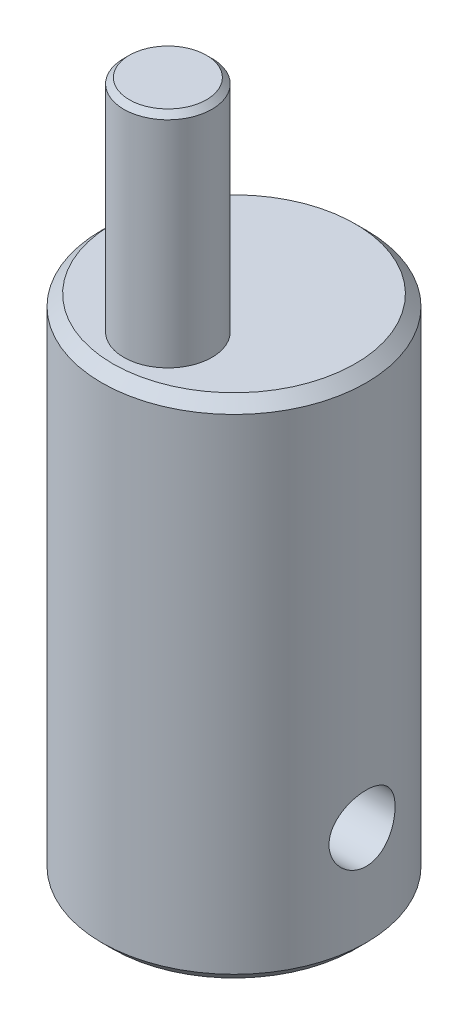
ISO-10303-21;
HEADER;
FILE_DESCRIPTION(('STEP AP214'),'2;1');
FILE_NAME('part.step','',(''),(''),'','','');
FILE_SCHEMA(('AUTOMOTIVE_DESIGN { 1 0 10303 214 1 1 1 1 }'));
ENDSEC;
DATA;
#1=APPLICATION_CONTEXT('core data for automotive mechanical design processes');
#2=APPLICATION_PROTOCOL_DEFINITION('international standard','automotive_design',2000,#1);
#3=PRODUCT_CONTEXT('',#1,'mechanical');
#4=PRODUCT('Part','Part','',(#3));
#5=PRODUCT_RELATED_PRODUCT_CATEGORY('part','',(#4));
#6=PRODUCT_DEFINITION_FORMATION('','',#4);
#7=PRODUCT_DEFINITION_CONTEXT('part definition',#1,'design');
#8=PRODUCT_DEFINITION('design','',#6,#7);
#9=PRODUCT_DEFINITION_SHAPE('','',#8);
#10=(LENGTH_UNIT() NAMED_UNIT(*) SI_UNIT(.MILLI.,.METRE.));
#11=(NAMED_UNIT(*) PLANE_ANGLE_UNIT() SI_UNIT($,.RADIAN.));
#12=(NAMED_UNIT(*) SI_UNIT($,.STERADIAN.) SOLID_ANGLE_UNIT());
#13=UNCERTAINTY_MEASURE_WITH_UNIT(LENGTH_MEASURE(1.E-05),#10,'distance_accuracy_value','');
#14=(GEOMETRIC_REPRESENTATION_CONTEXT(3) GLOBAL_UNCERTAINTY_ASSIGNED_CONTEXT((#13)) GLOBAL_UNIT_ASSIGNED_CONTEXT((#10,
#11,#12)) REPRESENTATION_CONTEXT('',''));
#15=CARTESIAN_POINT('',(0.,0.,0.));
#16=DIRECTION('',(0.,0.,1.));
#17=DIRECTION('',(1.,0.,0.));
#18=AXIS2_PLACEMENT_3D('',#15,#16,#17);
#19=CARTESIAN_POINT('',(0.,23.,0.));
#20=DIRECTION('',(0.,-1.,0.));
#21=DIRECTION('',(0.,0.,-1.));
#22=AXIS2_PLACEMENT_3D('',#19,#20,#21);
#23=CYLINDRICAL_SURFACE('',#22,6.);
#24=CARTESIAN_POINT('',(0.,0.499999999999994,0.));
#25=DIRECTION('',(0.,1.,0.));
#26=DIRECTION('',(0.,0.,1.));
#27=AXIS2_PLACEMENT_3D('',#24,#25,#26);
#28=CIRCLE('',#27,6.);
#29=CARTESIAN_POINT('',(0.,0.499999999999994,6.));
#30=VERTEX_POINT('',#29);
#31=EDGE_CURVE('E57',#30,#30,#28,.T.);
#32=ORIENTED_EDGE('',*,*,#31,.T.);
#33=EDGE_LOOP('',(#32));
#34=FACE_BOUND('',#33,.T.);
#35=CARTESIAN_POINT('',(0.,22.5,0.));
#36=DIRECTION('',(0.,1.,0.));
#37=DIRECTION('',(0.,0.,1.));
#38=AXIS2_PLACEMENT_3D('',#35,#36,#37);
#39=CIRCLE('',#38,6.);
#40=CARTESIAN_POINT('',(0.,22.5,6.));
#41=VERTEX_POINT('',#40);
#42=EDGE_CURVE('E62',#41,#41,#39,.F.);
#43=ORIENTED_EDGE('',*,*,#42,.T.);
#44=EDGE_LOOP('',(#43));
#45=FACE_BOUND('',#44,.T.);
#46=CARTESIAN_POINT('',(-6.,3.5,0.));
#47=CARTESIAN_POINT('',(-5.99999859868012,3.50000232573816,-0.082876088669731));
#48=CARTESIAN_POINT('',(-5.99826578131828,3.50689155077379,-0.165778157830763));
#49=CARTESIAN_POINT('',(-5.99152113829892,3.534225151307,-0.329206323770533));
#50=CARTESIAN_POINT('',(-5.98650745419968,3.55467720953785,-0.409731046870739));
#51=CARTESIAN_POINT('',(-5.9737562633204,3.60843925346209,-0.566020872182577));
#52=CARTESIAN_POINT('',(-5.96602202842087,3.64173379871528,-0.641791563430003));
#53=CARTESIAN_POINT('',(-5.94865343807593,3.72018139004483,-0.786672131904427));
#54=CARTESIAN_POINT('',(-5.9390190185405,3.76533483611894,-0.85578178434876));
#55=CARTESIAN_POINT('',(-5.91867413591801,3.86720078965421,-0.98680192730092));
#56=CARTESIAN_POINT('',(-5.90794707148533,3.92411157495918,-1.04855569006107));
#57=CARTESIAN_POINT('',(-5.88673620117529,4.04745220490892,-1.1617489272033));
#58=CARTESIAN_POINT('',(-5.87625242288348,4.1138831229465,-1.21318723694914));
#59=CARTESIAN_POINT('',(-5.8565477569971,4.25559522673744,-1.30502654279903));
#60=CARTESIAN_POINT('',(-5.84734794470605,4.3309932308104,-1.34525221592536));
#61=CARTESIAN_POINT('',(-5.83149494812223,4.48774841165836,-1.41239690855053));
#62=CARTESIAN_POINT('',(-5.82484135672789,4.56910463332576,-1.43931805543933));
#63=CARTESIAN_POINT('',(-5.81500476717551,4.73374349820248,-1.47855483680429));
#64=CARTESIAN_POINT('',(-5.81175491075426,4.8169548960498,-1.49115226833334));
#65=CARTESIAN_POINT('',(-5.80889362537741,4.98436856901398,-1.50226177506785));
#66=CARTESIAN_POINT('',(-5.80928160448643,5.06857068069861,-1.50077614181798));
#67=CARTESIAN_POINT('',(-5.81359205496618,5.23341580774448,-1.48398652463928));
#68=CARTESIAN_POINT('',(-5.81742863001879,5.3140956214651,-1.46901834019052));
#69=CARTESIAN_POINT('',(-5.82806709676483,5.47176105091129,-1.42622418690311));
#70=CARTESIAN_POINT('',(-5.83486919970696,5.54874640302898,-1.39839730206942));
#71=CARTESIAN_POINT('',(-5.85075113904186,5.69773801625207,-1.33038947793715));
#72=CARTESIAN_POINT('',(-5.85985327469421,5.76968617178955,-1.29008666723291));
#73=CARTESIAN_POINT('',(-5.87929710846386,5.90591870975684,-1.19835627601495));
#74=CARTESIAN_POINT('',(-5.88963902334735,5.97020174806726,-1.14692674880884));
#75=CARTESIAN_POINT('',(-5.91075880539781,6.0912036156944,-1.03266342468122));
#76=CARTESIAN_POINT('',(-5.92154069477971,6.14765449006135,-0.96954625816586));
#77=CARTESIAN_POINT('',(-5.94205965578786,6.24922124246391,-0.8346119175037));
#78=CARTESIAN_POINT('',(-5.95179669549415,6.29433677426357,-0.762794477707944));
#79=CARTESIAN_POINT('',(-5.96917732094182,6.37205058622439,-0.612115888681392));
#80=CARTESIAN_POINT('',(-5.97681360127725,6.40460534025443,-0.533231393208624));
#81=CARTESIAN_POINT('',(-5.98907916991418,6.45591730570957,-0.370876008142883));
#82=CARTESIAN_POINT('',(-5.99370903339281,6.47467715641814,-0.287405999150485));
#83=CARTESIAN_POINT('',(-5.99935499271374,6.49745756555884,-0.120539970390027));
#84=CARTESIAN_POINT('',(-6.00046053508278,6.5018430260753,-0.0371967199882097));
#85=CARTESIAN_POINT('',(-5.99918804814451,6.49675099794451,0.129032874801508));
#86=CARTESIAN_POINT('',(-5.99681033241846,6.48727475720087,0.211919259644595));
#87=CARTESIAN_POINT('',(-5.98889581127357,6.45502909160862,0.373614268776491));
#88=CARTESIAN_POINT('',(-5.98340634185811,6.43245873652301,0.452465118968754));
#89=CARTESIAN_POINT('',(-5.96988706634134,6.37489291597155,0.605257292452511));
#90=CARTESIAN_POINT('',(-5.96185700369892,6.33989619568683,0.679198119032634));
#91=CARTESIAN_POINT('',(-5.9439330792631,6.25776387112527,0.821523134429847));
#92=CARTESIAN_POINT('',(-5.93400867366932,6.21042388760324,0.88978544183583));
#93=CARTESIAN_POINT('',(-5.91344509187419,6.10521009120303,1.01752661364325));
#94=CARTESIAN_POINT('',(-5.90280579251705,6.04733446038309,1.07700395897301));
#95=CARTESIAN_POINT('',(-5.88168956960771,5.92099803915554,1.18699056807273));
#96=CARTESIAN_POINT('',(-5.87122304187281,5.85231229699758,1.23724386762203));
#97=CARTESIAN_POINT('',(-5.85192878377239,5.70726736553428,1.3255107590127));
#98=CARTESIAN_POINT('',(-5.84310098067026,5.63090851704025,1.36352489415794));
#99=CARTESIAN_POINT('',(-5.82818094734665,5.47309427758692,1.42595142060929));
#100=CARTESIAN_POINT('',(-5.82207255291905,5.39167237165599,1.45044439665407));
#101=CARTESIAN_POINT('',(-5.81326744090183,5.22569036211089,1.48534565995378));
#102=CARTESIAN_POINT('',(-5.81056997719936,5.14113094896751,1.49575702747866));
#103=CARTESIAN_POINT('',(-5.80894901203957,4.9738789761448,1.50203859033399));
#104=CARTESIAN_POINT('',(-5.80991932728263,4.89120256487527,1.49831789778012));
#105=CARTESIAN_POINT('',(-5.81527909007842,4.72769611133202,1.47737727831287));
#106=CARTESIAN_POINT('',(-5.81966846891856,4.64686603198635,1.46015762268677));
#107=CARTESIAN_POINT('',(-5.83131260682722,4.48979154093459,1.41293131944279));
#108=CARTESIAN_POINT('',(-5.83855015236309,4.41352269475979,1.38300140468038));
#109=CARTESIAN_POINT('',(-5.85507755724829,4.26703461728631,1.31126491360507));
#110=CARTESIAN_POINT('',(-5.86436770120773,4.19681622681308,1.26945669003419));
#111=CARTESIAN_POINT('',(-5.88425634263512,4.06244537099798,1.17386774863714));
#112=CARTESIAN_POINT('',(-5.89488264831757,3.99849892657604,1.11980316291225));
#113=CARTESIAN_POINT('',(-5.91608027246285,3.88045295520459,1.00178937118974));
#114=CARTESIAN_POINT('',(-5.92665157727059,3.82635576988703,0.937837821261146));
#115=CARTESIAN_POINT('',(-5.94677655647663,3.72858869143539,0.80046758670259));
#116=CARTESIAN_POINT('',(-5.95630833365868,3.68512538632842,0.726898422316387));
#117=CARTESIAN_POINT('',(-5.97304924975118,3.61125253705947,0.573266059510477));
#118=CARTESIAN_POINT('',(-5.98026005199781,3.58083363935146,0.49320756343674));
#119=CARTESIAN_POINT('',(-5.99048059565541,3.53842816967035,0.344410253243472));
#120=CARTESIAN_POINT('',(-5.9940258505269,3.52404875694657,0.276380170908069));
#121=CARTESIAN_POINT('',(-5.99878605231948,3.50483405637806,0.138906071536283));
#122=CARTESIAN_POINT('',(-6.00000117450894,3.4999980506947,0.0694621612426163));
#123=CARTESIAN_POINT('',(-6.,3.5,0.));
#124=B_SPLINE_CURVE_WITH_KNOTS('',3,(#46,#47,#48,#49,#50,#51,#52,#53,#54,#55,#56,#57,#58,#59,
#60,#61,#62,#63,#64,#65,#66,#67,#68,#69,#70,#71,#72,#73,#74,#75,#76,#77,#78,#79,#80,#81,#82,#83,
#84,#85,#86,#87,#88,#89,#90,#91,#92,#93,#94,#95,#96,#97,#98,#99,#100,#101,#102,#103,#104,#105,
#106,#107,#108,#109,#110,#111,#112,#113,#114,#115,#116,#117,#118,#119,#120,#121,#122,#123),
.UNSPECIFIED.,.T.,.F.,(4,2,2,2,2,2,2,2,2,2,2,2,2,2,2,2,2,2,2,2,2,2,2,2,2,2,2,2,2,2,2,2,2,2,2,2,
2,2,4),(0.,0.24837371247189,0.4968882377639,0.745104902286106,0.993329940169328,
1.24614435437139,1.49898729580062,1.75558647545807,2.01214461169369,2.2635629509943,
2.51494038112697,2.76022497007018,3.00552703466038,3.25330527873879,3.50112690836163,
3.75601500969019,4.01091089558247,4.26668229009114,4.52240473688643,4.77158308949276,
5.02073901112743,5.26620274514037,5.51169127322291,5.76153587565352,6.01142363008019,
6.26744509204476,6.52345518749508,6.77792254614037,7.03233423252408,7.27943780398613,
7.52653640956034,7.77216400559447,8.01782568136901,8.2698957640991,8.52202569770418,
8.77872185499588,9.0352336382135,9.24342242942149,9.4515955604304),.UNSPECIFIED.);
#125=CARTESIAN_POINT('',(-6.,3.5,0.));
#126=VERTEX_POINT('',#125);
#127=EDGE_CURVE('E76',#126,#126,#124,.T.);
#128=ORIENTED_EDGE('',*,*,#127,.T.);
#129=EDGE_LOOP('',(#128));
#130=FACE_BOUND('',#129,.T.);
#131=CARTESIAN_POINT('',(5.80947501931112,5.,-1.5));
#132=CARTESIAN_POINT('',(5.80947660051185,4.91716954944523,-1.49999764715507));
#133=CARTESIAN_POINT('',(5.81126583608348,4.8343130607932,-1.49311574729838));
#134=CARTESIAN_POINT('',(5.81821117195949,4.67097945309558,-1.46581387527848));
#135=CARTESIAN_POINT('',(5.82336923173088,4.590503747319,-1.44538602404532));
#136=CARTESIAN_POINT('',(5.8364323475758,4.43431787708778,-1.39169471977917));
#137=CARTESIAN_POINT('',(5.84433385614245,4.3586017067686,-1.35844783671268));
#138=CARTESIAN_POINT('',(5.86198915217285,4.21381348847605,-1.28011268475685));
#139=CARTESIAN_POINT('',(5.87174301827101,4.14474172275186,-1.23502391313642));
#140=CARTESIAN_POINT('',(5.89224429813367,4.01368301284268,-1.13322505638713));
#141=CARTESIAN_POINT('',(5.90300758573818,3.95186383978997,-1.07630213262243));
#142=CARTESIAN_POINT('',(5.92417725309178,3.83854316338379,-0.952909238460399));
#143=CARTESIAN_POINT('',(5.93458359939834,3.78704262462695,-0.886438376508184));
#144=CARTESIAN_POINT('',(5.95404249312349,3.69513471942123,-0.744687120647373));
#145=CARTESIAN_POINT('',(5.96307412440355,3.65489216710312,-0.669296745717072));
#146=CARTESIAN_POINT('',(5.9785848715559,3.58771421350815,-0.512557910575657));
#147=CARTESIAN_POINT('',(5.98506436400607,3.56077684885069,-0.431210331475164));
#148=CARTESIAN_POINT('',(5.99462855308908,3.52151129925285,-0.266615255252497));
#149=CARTESIAN_POINT('',(5.99777936306588,3.50889821340405,-0.183439631729385));
#150=CARTESIAN_POINT('',(6.00056156464378,3.49774497243467,-0.0160972915576618));
#151=CARTESIAN_POINT('',(6.00019347658022,3.49920273667424,0.068069276722841));
#152=CARTESIAN_POINT('',(5.99602856972121,3.51594491015009,0.233028370758581));
#153=CARTESIAN_POINT('',(5.99230801404524,3.53092179503231,0.3138543234016));
#154=CARTESIAN_POINT('',(5.98194501914912,3.5737827620291,0.471807371120529));
#155=CARTESIAN_POINT('',(5.97530242439064,3.60166753122645,0.548934269055657));
#156=CARTESIAN_POINT('',(5.95972505820537,3.66980154241224,0.69811005525271));
#157=CARTESIAN_POINT('',(5.95077011817032,3.71016022679705,0.770106764649757));
#158=CARTESIAN_POINT('',(5.93153942285789,3.80201340746975,0.906413433510733));
#159=CARTESIAN_POINT('',(5.92126343791494,3.85350984113637,0.970722052628258));
#160=CARTESIAN_POINT('',(5.90018228261712,3.96782524518943,1.09166105262743));
#161=CARTESIAN_POINT('',(5.88937031715551,4.03091293540866,1.1480365186128));
#162=CARTESIAN_POINT('',(5.86869026110024,4.16575998412415,1.24946456394453));
#163=CARTESIAN_POINT('',(5.85882221463582,4.2375197476946,1.29451661406902));
#164=CARTESIAN_POINT('',(5.84112298098989,4.38817402048938,1.3721821935339));
#165=CARTESIAN_POINT('',(5.83330190235432,4.46710143818792,1.40473435045574));
#166=CARTESIAN_POINT('',(5.82071184083974,4.62955128084587,1.45602843095451));
#167=CARTESIAN_POINT('',(5.81594220486131,4.71307271838988,1.47477330982936));
#168=CARTESIAN_POINT('',(5.81013213623484,4.87997570091387,1.49749778319911));
#169=CARTESIAN_POINT('',(5.80899653456189,4.96330267599778,1.50185428435178));
#170=CARTESIAN_POINT('',(5.81032406088623,5.12949316194689,1.49671019430933));
#171=CARTESIAN_POINT('',(5.81278685760759,5.21235671477074,1.48721087870928));
#172=CARTESIAN_POINT('',(5.82094249172736,5.37386855897282,1.4549552783626));
#173=CARTESIAN_POINT('',(5.82658182140625,5.45256363594251,1.43241844096905));
#174=CARTESIAN_POINT('',(5.84040430962577,5.60505887471101,1.37497084900237));
#175=CARTESIAN_POINT('',(5.84858776949168,5.6788584554332,1.34005862862753));
#176=CARTESIAN_POINT('',(5.86677682255957,5.82106476672041,1.25806240076193));
#177=CARTESIAN_POINT('',(5.87681501163985,5.88933730402586,1.21075305230138));
#178=CARTESIAN_POINT('',(5.89750249843029,6.01711301768081,1.10559043940168));
#179=CARTESIAN_POINT('',(5.90815189637082,6.07661474999004,1.04773544220816));
#180=CARTESIAN_POINT('',(5.92918441818963,6.18668662554257,0.921394081477089));
#181=CARTESIAN_POINT('',(5.93955421237101,6.23699603752929,0.852677928797389));
#182=CARTESIAN_POINT('',(5.9585832996824,6.32536152017075,0.707554024042013));
#183=CARTESIAN_POINT('',(5.96724268202376,6.36341822996492,0.631146673436387));
#184=CARTESIAN_POINT('',(5.98182069442988,6.42586762071676,0.473337302596636));
#185=CARTESIAN_POINT('',(5.98775898013446,6.45035857062744,0.391976071541822));
#186=CARTESIAN_POINT('',(5.99631176037473,6.48527620076505,0.226124640478212));
#187=CARTESIAN_POINT('',(5.99892689636045,6.49570559524343,0.141635047561866));
#188=CARTESIAN_POINT('',(6.00051254113217,6.5020513843633,-0.0256252896649888));
#189=CARTESIAN_POINT('',(5.99957968320012,6.49835256364309,-0.108380740449049));
#190=CARTESIAN_POINT('',(5.99438844686135,6.4774282590585,-0.272051244622109));
#191=CARTESIAN_POINT('',(5.99013016735642,6.46020317748035,-0.352966352671329));
#192=CARTESIAN_POINT('',(5.97878149280944,6.41292167034361,-0.510256553467223));
#193=CARTESIAN_POINT('',(5.97170646753999,6.38293482002806,-0.586653741871528));
#194=CARTESIAN_POINT('',(5.95546933370076,6.31104413147101,-0.733375579562202));
#195=CARTESIAN_POINT('',(5.94630696206604,6.26913879099565,-0.803699461897577));
#196=CARTESIAN_POINT('',(5.92660874521999,6.17342714900439,-0.938102892635848));
#197=CARTESIAN_POINT('',(5.91604525418417,6.11935978563893,-1.00199248245088));
#198=CARTESIAN_POINT('',(5.89485973579863,6.0013657220393,-1.11992253040688));
#199=CARTESIAN_POINT('',(5.88423769428833,5.93743652585314,-1.17396048760228));
#200=CARTESIAN_POINT('',(5.86391213790822,5.800097878698,-1.27164303971884));
#201=CARTESIAN_POINT('',(5.85422945594827,5.72653381488106,-1.31507492916982));
#202=CARTESIAN_POINT('',(5.83715933325923,5.57291676511595,-1.3888903449235));
#203=CARTESIAN_POINT('',(5.82977022370054,5.49286855083989,-1.41928336463958));
#204=CARTESIAN_POINT('',(5.81927863109675,5.34413448225993,-1.46163379284816));
#205=CARTESIAN_POINT('',(5.8156299450082,5.27616025342421,-1.47598975589307));
#206=CARTESIAN_POINT('',(5.81072757878358,5.13879669650006,-1.4951734388599));
#207=CARTESIAN_POINT('',(5.80947369434945,5.06940748963241,-1.50000197155828));
#208=CARTESIAN_POINT('',(5.80947501931112,5.,-1.5));
#209=B_SPLINE_CURVE_WITH_KNOTS('',3,(#131,#132,#133,#134,#135,#136,#137,#138,#139,#140,#141,
#142,#143,#144,#145,#146,#147,#148,#149,#150,#151,#152,#153,#154,#155,#156,#157,#158,#159,#160,
#161,#162,#163,#164,#165,#166,#167,#168,#169,#170,#171,#172,#173,#174,#175,#176,#177,#178,#179,
#180,#181,#182,#183,#184,#185,#186,#187,#188,#189,#190,#191,#192,#193,#194,#195,#196,#197,#198,
#199,#200,#201,#202,#203,#204,#205,#206,#207,#208),.UNSPECIFIED.,.T.,.F.,(4,2,2,2,2,2,2,2,2,2,2,
2,2,2,2,2,2,2,2,2,2,2,2,2,2,2,2,2,2,2,2,2,2,2,2,2,2,2,4),(0.,0.248236465041681,0.4966174448572,
0.744678436299612,0.99274996053287,1.24574372515786,1.4987611288792,1.75530897838752,
2.01181895908255,2.26313250597208,2.51440889199612,2.76010957613368,3.00582334034872,
3.25375724552667,3.50173431281348,3.75642279943147,4.01112318719881,4.26705859205041,
4.52293920077728,4.7720614485703,5.02116076310281,5.26618443005524,5.5112371285285,
5.76109707515494,6.01099811331027,6.26715198579191,6.52329249431732,6.77755243684158,
7.03176329345423,7.27910067676474,7.52643070426189,7.77242925935826,8.01845883442843,
8.27038257949242,8.52237018939305,8.77905886370806,9.03556032819972,9.24358696306398,
9.45159585059712),.UNSPECIFIED.);
#210=CARTESIAN_POINT('',(5.80947501931112,5.,-1.5));
#211=VERTEX_POINT('',#210);
#212=EDGE_CURVE('E85',#211,#211,#209,.T.);
#213=ORIENTED_EDGE('',*,*,#212,.T.);
#214=EDGE_LOOP('',(#213));
#215=FACE_BOUND('',#214,.T.);
#216=ADVANCED_FACE('F43',(#34,#45,#130,#215),#23,.T.);
#217=CARTESIAN_POINT('',(0.,23.,0.));
#218=DIRECTION('',(0.,1.,0.));
#219=DIRECTION('',(0.,0.,1.));
#220=AXIS2_PLACEMENT_3D('',#217,#218,#219);
#221=PLANE('',#220);
#222=CARTESIAN_POINT('',(0.,23.,0.));
#223=DIRECTION('',(0.,1.,0.));
#224=DIRECTION('',(0.,0.,1.));
#225=AXIS2_PLACEMENT_3D('',#222,#223,#224);
#226=CIRCLE('',#225,5.50000000000001);
#227=CARTESIAN_POINT('',(0.,23.,5.50000000000001));
#228=VERTEX_POINT('',#227);
#229=EDGE_CURVE('E10',#228,#228,#226,.T.);
#230=ORIENTED_EDGE('',*,*,#229,.T.);
#231=EDGE_LOOP('',(#230));
#232=FACE_BOUND('',#231,.T.);
#233=CARTESIAN_POINT('',(0.,23.,3.));
#234=DIRECTION('',(0.,1.,0.));
#235=DIRECTION('',(0.,0.,1.));
#236=AXIS2_PLACEMENT_3D('',#233,#234,#235);
#237=CIRCLE('',#236,2.);
#238=CARTESIAN_POINT('',(0.,23.,5.));
#239=VERTEX_POINT('',#238);
#240=EDGE_CURVE('E127',#239,#239,#237,.T.);
#241=ORIENTED_EDGE('',*,*,#240,.F.);
#242=EDGE_LOOP('',(#241));
#243=FACE_BOUND('',#242,.T.);
#244=ADVANCED_FACE('F109',(#232,#243),#221,.T.);
#245=CARTESIAN_POINT('',(0.,0.,0.));
#246=DIRECTION('',(0.,1.,0.));
#247=DIRECTION('',(0.,0.,1.));
#248=AXIS2_PLACEMENT_3D('',#245,#246,#247);
#249=PLANE('',#248);
#250=CARTESIAN_POINT('',(0.,0.,0.));
#251=DIRECTION('',(0.,1.,0.));
#252=DIRECTION('',(0.,0.,1.));
#253=AXIS2_PLACEMENT_3D('',#250,#251,#252);
#254=CIRCLE('',#253,5.5);
#255=CARTESIAN_POINT('',(0.,0.,5.5));
#256=VERTEX_POINT('',#255);
#257=EDGE_CURVE('E52',#256,#256,#254,.F.);
#258=ORIENTED_EDGE('',*,*,#257,.T.);
#259=EDGE_LOOP('',(#258));
#260=FACE_BOUND('',#259,.T.);
#261=ADVANCED_FACE('F107',(#260),#249,.F.);
#262=CARTESIAN_POINT('',(0.,33.,3.));
#263=DIRECTION('',(0.,-1.,0.));
#264=DIRECTION('',(0.,0.,-1.));
#265=AXIS2_PLACEMENT_3D('',#262,#263,#264);
#266=CYLINDRICAL_SURFACE('',#265,2.);
#267=CARTESIAN_POINT('',(0.,32.75,3.));
#268=DIRECTION('',(0.,1.,0.));
#269=DIRECTION('',(0.,0.,1.));
#270=AXIS2_PLACEMENT_3D('',#267,#268,#269);
#271=CIRCLE('',#270,2.);
#272=CARTESIAN_POINT('',(0.,32.75,5.));
#273=VERTEX_POINT('',#272);
#274=EDGE_CURVE('E68',#273,#273,#271,.F.);
#275=ORIENTED_EDGE('',*,*,#274,.T.);
#276=EDGE_LOOP('',(#275));
#277=FACE_BOUND('',#276,.T.);
#278=ORIENTED_EDGE('',*,*,#240,.T.);
#279=EDGE_LOOP('',(#278));
#280=FACE_BOUND('',#279,.T.);
#281=ADVANCED_FACE('F103',(#277,#280),#266,.T.);
#282=CARTESIAN_POINT('',(0.,33.,3.));
#283=DIRECTION('',(0.,1.,0.));
#284=DIRECTION('',(0.,0.,1.));
#285=AXIS2_PLACEMENT_3D('',#282,#283,#284);
#286=PLANE('',#285);
#287=CARTESIAN_POINT('',(0.,33.,3.));
#288=DIRECTION('',(0.,1.,0.));
#289=DIRECTION('',(0.,0.,1.));
#290=AXIS2_PLACEMENT_3D('',#287,#288,#289);
#291=CIRCLE('',#290,1.75000000000001);
#292=CARTESIAN_POINT('',(0.,33.,4.75000000000001));
#293=VERTEX_POINT('',#292);
#294=EDGE_CURVE('E72',#293,#293,#291,.T.);
#295=ORIENTED_EDGE('',*,*,#294,.T.);
#296=EDGE_LOOP('',(#295));
#297=FACE_BOUND('',#296,.T.);
#298=ADVANCED_FACE('F98',(#297),#286,.T.);
#299=CARTESIAN_POINT('',(-6.,5.,0.));
#300=DIRECTION('',(1.,0.,0.));
#301=DIRECTION('',(0.,0.,-1.));
#302=AXIS2_PLACEMENT_3D('',#299,#300,#301);
#303=CYLINDRICAL_SURFACE('',#302,1.5);
#304=ORIENTED_EDGE('',*,*,#212,.F.);
#305=EDGE_LOOP('',(#304));
#306=FACE_BOUND('',#305,.T.);
#307=ORIENTED_EDGE('',*,*,#127,.F.);
#308=EDGE_LOOP('',(#307));
#309=FACE_BOUND('',#308,.T.);
#310=ADVANCED_FACE('F93',(#306,#309),#303,.F.);
#311=CARTESIAN_POINT('',(0.,33.,3.));
#312=DIRECTION('',(0.,-1.,0.));
#313=DIRECTION('',(0.,0.,-1.));
#314=AXIS2_PLACEMENT_3D('',#311,#312,#313);
#315=CONICAL_SURFACE('',#314,1.75000000000001,0.785398163397438);
#316=ORIENTED_EDGE('',*,*,#274,.F.);
#317=EDGE_LOOP('',(#316));
#318=FACE_BOUND('',#317,.T.);
#319=ORIENTED_EDGE('',*,*,#294,.F.);
#320=EDGE_LOOP('',(#319));
#321=FACE_BOUND('',#320,.T.);
#322=ADVANCED_FACE('F97',(#318,#321),#315,.T.);
#323=CARTESIAN_POINT('',(0.,0.499999999999994,0.));
#324=DIRECTION('',(0.,1.,0.));
#325=DIRECTION('',(0.,0.,1.));
#326=AXIS2_PLACEMENT_3D('',#323,#324,#325);
#327=CONICAL_SURFACE('',#326,6.,0.785398163397452);
#328=ORIENTED_EDGE('',*,*,#257,.F.);
#329=EDGE_LOOP('',(#328));
#330=FACE_BOUND('',#329,.T.);
#331=ORIENTED_EDGE('',*,*,#31,.F.);
#332=EDGE_LOOP('',(#331));
#333=FACE_BOUND('',#332,.T.);
#334=ADVANCED_FACE('F137',(#330,#333),#327,.T.);
#335=CARTESIAN_POINT('',(0.,23.,0.));
#336=DIRECTION('',(0.,-1.,0.));
#337=DIRECTION('',(0.,0.,-1.));
#338=AXIS2_PLACEMENT_3D('',#335,#336,#337);
#339=CONICAL_SURFACE('',#338,5.50000000000001,0.785398163397445);
#340=ORIENTED_EDGE('',*,*,#42,.F.);
#341=EDGE_LOOP('',(#340));
#342=FACE_BOUND('',#341,.T.);
#343=ORIENTED_EDGE('',*,*,#229,.F.);
#344=EDGE_LOOP('',(#343));
#345=FACE_BOUND('',#344,.T.);
#346=ADVANCED_FACE('F46',(#342,#345),#339,.T.);
#347=CLOSED_SHELL('',(#216,#244,#261,#281,#298,#310,#322,#334,#346));
#348=MANIFOLD_SOLID_BREP('B2',#347);
#349=ADVANCED_BREP_SHAPE_REPRESENTATION('',(#18,#348),#14);
#350=SHAPE_DEFINITION_REPRESENTATION(#9,#349);
ENDSEC;
END-ISO-10303-21;
